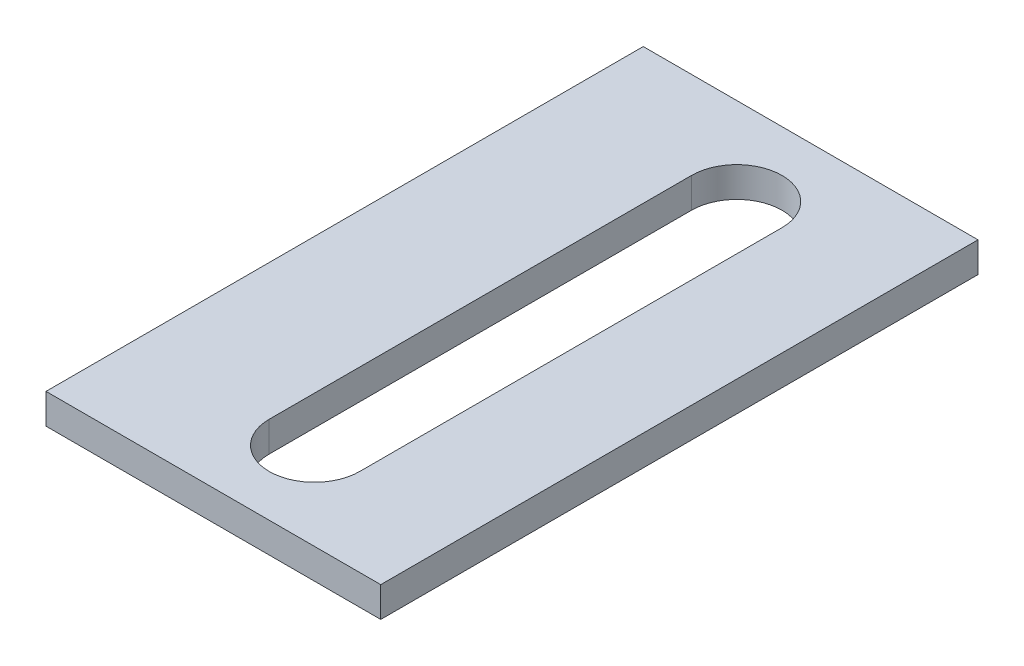
ISO-10303-21;
HEADER;
FILE_DESCRIPTION(('STEP AP214'),'2;1');
FILE_NAME('part.step','',(''),(''),'','','');
FILE_SCHEMA(('AUTOMOTIVE_DESIGN { 1 0 10303 214 1 1 1 1 }'));
ENDSEC;
DATA;
#1=APPLICATION_CONTEXT('core data for automotive mechanical design processes');
#2=APPLICATION_PROTOCOL_DEFINITION('international standard','automotive_design',2000,#1);
#3=PRODUCT_CONTEXT('',#1,'mechanical');
#4=PRODUCT('Part','Part','',(#3));
#5=PRODUCT_RELATED_PRODUCT_CATEGORY('part','',(#4));
#6=PRODUCT_DEFINITION_FORMATION('','',#4);
#7=PRODUCT_DEFINITION_CONTEXT('part definition',#1,'design');
#8=PRODUCT_DEFINITION('design','',#6,#7);
#9=PRODUCT_DEFINITION_SHAPE('','',#8);
#10=(LENGTH_UNIT() NAMED_UNIT(*) SI_UNIT(.MILLI.,.METRE.));
#11=(NAMED_UNIT(*) PLANE_ANGLE_UNIT() SI_UNIT($,.RADIAN.));
#12=(NAMED_UNIT(*) SI_UNIT($,.STERADIAN.) SOLID_ANGLE_UNIT());
#13=UNCERTAINTY_MEASURE_WITH_UNIT(LENGTH_MEASURE(1.E-05),#10,'distance_accuracy_value','');
#14=(GEOMETRIC_REPRESENTATION_CONTEXT(3) GLOBAL_UNCERTAINTY_ASSIGNED_CONTEXT((#13)) GLOBAL_UNIT_ASSIGNED_CONTEXT((#10,
#11,#12)) REPRESENTATION_CONTEXT('',''));
#15=CARTESIAN_POINT('',(0.,0.,0.));
#16=DIRECTION('',(0.,0.,1.));
#17=DIRECTION('',(1.,0.,0.));
#18=AXIS2_PLACEMENT_3D('',#15,#16,#17);
#19=CARTESIAN_POINT('',(-12.,8.4,6.9));
#20=DIRECTION('',(1.,0.,0.));
#21=DIRECTION('',(0.,0.,-1.));
#22=AXIS2_PLACEMENT_3D('',#19,#20,#21);
#23=PLANE('',#22);
#24=DIRECTION('',(0.,1.,0.));
#25=VECTOR('',#24,1.);
#26=CARTESIAN_POINT('',(-12.,8.4,-9.9));
#27=LINE('',#26,#25);
#28=CARTESIAN_POINT('',(-12.,7.4,-9.9));
#29=VERTEX_POINT('',#28);
#30=CARTESIAN_POINT('',(-12.,8.4,-9.9));
#31=VERTEX_POINT('',#30);
#32=EDGE_CURVE('E121',#29,#31,#27,.T.);
#33=ORIENTED_EDGE('',*,*,#32,.F.);
#34=DIRECTION('',(0.,0.,-1.));
#35=VECTOR('',#34,1.);
#36=CARTESIAN_POINT('',(-12.,7.4,-9.9));
#37=LINE('',#36,#35);
#38=CARTESIAN_POINT('',(-12.,7.4,9.9));
#39=VERTEX_POINT('',#38);
#40=EDGE_CURVE('E107',#39,#29,#37,.T.);
#41=ORIENTED_EDGE('',*,*,#40,.F.);
#42=DIRECTION('',(0.,-1.,0.));
#43=VECTOR('',#42,1.);
#44=CARTESIAN_POINT('',(-12.,8.4,9.9));
#45=LINE('',#44,#43);
#46=CARTESIAN_POINT('',(-12.,8.4,9.9));
#47=VERTEX_POINT('',#46);
#48=EDGE_CURVE('E137',#47,#39,#45,.T.);
#49=ORIENTED_EDGE('',*,*,#48,.F.);
#50=DIRECTION('',(0.,0.,1.));
#51=VECTOR('',#50,1.);
#52=CARTESIAN_POINT('',(-12.,8.4,6.9));
#53=LINE('',#52,#51);
#54=EDGE_CURVE('E128',#31,#47,#53,.T.);
#55=ORIENTED_EDGE('',*,*,#54,.F.);
#56=EDGE_LOOP('',(#33,#41,#49,#55));
#57=FACE_BOUND('',#56,.T.);
#58=ADVANCED_FACE('F44',(#57),#23,.F.);
#59=CARTESIAN_POINT('',(0.,8.4,0.));
#60=DIRECTION('',(0.,1.,0.));
#61=DIRECTION('',(0.,0.,1.));
#62=AXIS2_PLACEMENT_3D('',#59,#60,#61);
#63=PLANE('',#62);
#64=DIRECTION('',(0.,0.,1.));
#65=VECTOR('',#64,1.);
#66=CARTESIAN_POINT('',(-0.902865486843041,8.4,-26.1));
#67=LINE('',#66,#65);
#68=CARTESIAN_POINT('',(-0.902865486843041,8.4,-9.9));
#69=VERTEX_POINT('',#68);
#70=CARTESIAN_POINT('',(-0.902865486843041,8.4,9.9));
#71=VERTEX_POINT('',#70);
#72=EDGE_CURVE('E181',#69,#71,#67,.T.);
#73=ORIENTED_EDGE('',*,*,#72,.F.);
#74=DIRECTION('',(1.,0.,0.));
#75=VECTOR('',#74,1.);
#76=CARTESIAN_POINT('',(-12.,8.4,-9.9));
#77=LINE('',#76,#75);
#78=EDGE_CURVE('E131',#31,#69,#77,.T.);
#79=ORIENTED_EDGE('',*,*,#78,.F.);
#80=ORIENTED_EDGE('',*,*,#54,.T.);
#81=DIRECTION('',(-1.,0.,0.));
#82=VECTOR('',#81,1.);
#83=CARTESIAN_POINT('',(-12.,8.4,9.9));
#84=LINE('',#83,#82);
#85=EDGE_CURVE('E132',#71,#47,#84,.T.);
#86=ORIENTED_EDGE('',*,*,#85,.F.);
#87=EDGE_LOOP('',(#73,#79,#80,#86));
#88=FACE_BOUND('',#87,.T.);
#89=CARTESIAN_POINT('',(-6.,8.4,-7.));
#90=DIRECTION('',(0.,1.,0.));
#91=DIRECTION('',(0.,0.,1.));
#92=AXIS2_PLACEMENT_3D('',#89,#90,#91);
#93=CIRCLE('',#92,1.5);
#94=CARTESIAN_POINT('',(-4.5,8.4,-7.));
#95=VERTEX_POINT('',#94);
#96=CARTESIAN_POINT('',(-7.5,8.4,-7.));
#97=VERTEX_POINT('',#96);
#98=EDGE_CURVE('E11',#95,#97,#93,.T.);
#99=ORIENTED_EDGE('',*,*,#98,.F.);
#100=DIRECTION('',(0.,0.,-1.));
#101=VECTOR('',#100,1.);
#102=CARTESIAN_POINT('',(-4.5,8.4,0.));
#103=LINE('',#102,#101);
#104=CARTESIAN_POINT('',(-4.5,8.4,7.));
#105=VERTEX_POINT('',#104);
#106=EDGE_CURVE('E146',#105,#95,#103,.T.);
#107=ORIENTED_EDGE('',*,*,#106,.F.);
#108=CARTESIAN_POINT('',(-6.,8.4,7.));
#109=DIRECTION('',(0.,1.,0.));
#110=DIRECTION('',(0.,0.,1.));
#111=AXIS2_PLACEMENT_3D('',#108,#109,#110);
#112=CIRCLE('',#111,1.5);
#113=CARTESIAN_POINT('',(-7.5,8.4,7.));
#114=VERTEX_POINT('',#113);
#115=EDGE_CURVE('E52',#114,#105,#112,.T.);
#116=ORIENTED_EDGE('',*,*,#115,.F.);
#117=DIRECTION('',(0.,0.,1.));
#118=VECTOR('',#117,1.);
#119=CARTESIAN_POINT('',(-7.5,8.4,0.));
#120=LINE('',#119,#118);
#121=EDGE_CURVE('E143',#97,#114,#120,.T.);
#122=ORIENTED_EDGE('',*,*,#121,.F.);
#123=EDGE_LOOP('',(#99,#107,#116,#122));
#124=FACE_BOUND('',#123,.T.);
#125=ADVANCED_FACE('F163',(#88,#124),#63,.T.);
#126=CARTESIAN_POINT('',(0.,0.,-9.9));
#127=DIRECTION('',(0.,0.,1.));
#128=DIRECTION('',(1.,0.,0.));
#129=AXIS2_PLACEMENT_3D('',#126,#127,#128);
#130=PLANE('',#129);
#131=DIRECTION('',(0.,-1.,0.));
#132=VECTOR('',#131,1.);
#133=CARTESIAN_POINT('',(-0.902865486843041,0.,-9.9));
#134=LINE('',#133,#132);
#135=CARTESIAN_POINT('',(-0.902865486843041,7.4,-9.9));
#136=VERTEX_POINT('',#135);
#137=EDGE_CURVE('E123',#69,#136,#134,.T.);
#138=ORIENTED_EDGE('',*,*,#137,.T.);
#139=DIRECTION('',(1.,0.,0.));
#140=VECTOR('',#139,1.);
#141=CARTESIAN_POINT('',(-12.,7.4,-9.9));
#142=LINE('',#141,#140);
#143=EDGE_CURVE('E67',#29,#136,#142,.T.);
#144=ORIENTED_EDGE('',*,*,#143,.F.);
#145=ORIENTED_EDGE('',*,*,#32,.T.);
#146=ORIENTED_EDGE('',*,*,#78,.T.);
#147=EDGE_LOOP('',(#138,#144,#145,#146));
#148=FACE_BOUND('',#147,.T.);
#149=ADVANCED_FACE('F119',(#148),#130,.F.);
#150=CARTESIAN_POINT('',(0.,0.,9.9));
#151=DIRECTION('',(0.,0.,1.));
#152=DIRECTION('',(1.,0.,0.));
#153=AXIS2_PLACEMENT_3D('',#150,#151,#152);
#154=PLANE('',#153);
#155=DIRECTION('',(-1.,0.,0.));
#156=VECTOR('',#155,1.);
#157=CARTESIAN_POINT('',(0.,7.4,9.9));
#158=LINE('',#157,#156);
#159=CARTESIAN_POINT('',(-0.902865486843041,7.4,9.9));
#160=VERTEX_POINT('',#159);
#161=EDGE_CURVE('E110',#160,#39,#158,.T.);
#162=ORIENTED_EDGE('',*,*,#161,.F.);
#163=DIRECTION('',(0.,-1.,0.));
#164=VECTOR('',#163,1.);
#165=CARTESIAN_POINT('',(-0.902865486843041,8.4,9.9));
#166=LINE('',#165,#164);
#167=EDGE_CURVE('E184',#71,#160,#166,.T.);
#168=ORIENTED_EDGE('',*,*,#167,.F.);
#169=ORIENTED_EDGE('',*,*,#85,.T.);
#170=ORIENTED_EDGE('',*,*,#48,.T.);
#171=EDGE_LOOP('',(#162,#168,#169,#170));
#172=FACE_BOUND('',#171,.T.);
#173=ADVANCED_FACE('F206',(#172),#154,.T.);
#174=CARTESIAN_POINT('',(-6.,-30.6,-7.));
#175=DIRECTION('',(0.,1.,0.));
#176=DIRECTION('',(0.,0.,1.));
#177=AXIS2_PLACEMENT_3D('',#174,#175,#176);
#178=CYLINDRICAL_SURFACE('',#177,1.5);
#179=DIRECTION('',(0.,1.,0.));
#180=VECTOR('',#179,1.);
#181=CARTESIAN_POINT('',(-7.5,-30.6,-7.));
#182=LINE('',#181,#180);
#183=CARTESIAN_POINT('',(-7.5,7.4,-7.));
#184=VERTEX_POINT('',#183);
#185=EDGE_CURVE('E172',#184,#97,#182,.T.);
#186=ORIENTED_EDGE('',*,*,#185,.F.);
#187=CARTESIAN_POINT('',(-6.,7.4,-7.));
#188=DIRECTION('',(0.,1.,0.));
#189=DIRECTION('',(0.,0.,1.));
#190=AXIS2_PLACEMENT_3D('',#187,#188,#189);
#191=CIRCLE('',#190,1.5);
#192=CARTESIAN_POINT('',(-4.5,7.4,-7.));
#193=VERTEX_POINT('',#192);
#194=EDGE_CURVE('E59',#184,#193,#191,.F.);
#195=ORIENTED_EDGE('',*,*,#194,.T.);
#196=DIRECTION('',(0.,1.,0.));
#197=VECTOR('',#196,1.);
#198=CARTESIAN_POINT('',(-4.5,-30.6,-7.));
#199=LINE('',#198,#197);
#200=EDGE_CURVE('E147',#193,#95,#199,.T.);
#201=ORIENTED_EDGE('',*,*,#200,.T.);
#202=ORIENTED_EDGE('',*,*,#98,.T.);
#203=EDGE_LOOP('',(#186,#195,#201,#202));
#204=FACE_BOUND('',#203,.T.);
#205=ADVANCED_FACE('F220',(#204),#178,.F.);
#206=CARTESIAN_POINT('',(-6.,-30.6,7.));
#207=DIRECTION('',(0.,1.,0.));
#208=DIRECTION('',(0.,0.,1.));
#209=AXIS2_PLACEMENT_3D('',#206,#207,#208);
#210=CYLINDRICAL_SURFACE('',#209,1.5);
#211=DIRECTION('',(0.,1.,0.));
#212=VECTOR('',#211,1.);
#213=CARTESIAN_POINT('',(-4.5,-30.6,7.));
#214=LINE('',#213,#212);
#215=CARTESIAN_POINT('',(-4.5,7.4,7.));
#216=VERTEX_POINT('',#215);
#217=EDGE_CURVE('E156',#216,#105,#214,.T.);
#218=ORIENTED_EDGE('',*,*,#217,.F.);
#219=CARTESIAN_POINT('',(-6.,7.4,7.));
#220=DIRECTION('',(0.,1.,0.));
#221=DIRECTION('',(0.,0.,1.));
#222=AXIS2_PLACEMENT_3D('',#219,#220,#221);
#223=CIRCLE('',#222,1.5);
#224=CARTESIAN_POINT('',(-7.5,7.4,7.));
#225=VERTEX_POINT('',#224);
#226=EDGE_CURVE('E196',#216,#225,#223,.F.);
#227=ORIENTED_EDGE('',*,*,#226,.T.);
#228=DIRECTION('',(0.,1.,0.));
#229=VECTOR('',#228,1.);
#230=CARTESIAN_POINT('',(-7.5,-30.6,7.));
#231=LINE('',#230,#229);
#232=EDGE_CURVE('E158',#225,#114,#231,.T.);
#233=ORIENTED_EDGE('',*,*,#232,.T.);
#234=ORIENTED_EDGE('',*,*,#115,.T.);
#235=EDGE_LOOP('',(#218,#227,#233,#234));
#236=FACE_BOUND('',#235,.T.);
#237=ADVANCED_FACE('F154',(#236),#210,.F.);
#238=CARTESIAN_POINT('',(-4.5,-30.6,-7.));
#239=DIRECTION('',(1.,0.,0.));
#240=DIRECTION('',(0.,0.,-1.));
#241=AXIS2_PLACEMENT_3D('',#238,#239,#240);
#242=PLANE('',#241);
#243=ORIENTED_EDGE('',*,*,#200,.F.);
#244=DIRECTION('',(0.,0.,1.));
#245=VECTOR('',#244,1.);
#246=CARTESIAN_POINT('',(-4.5,7.4,-7.));
#247=LINE('',#246,#245);
#248=EDGE_CURVE('E190',#193,#216,#247,.T.);
#249=ORIENTED_EDGE('',*,*,#248,.T.);
#250=ORIENTED_EDGE('',*,*,#217,.T.);
#251=ORIENTED_EDGE('',*,*,#106,.T.);
#252=EDGE_LOOP('',(#243,#249,#250,#251));
#253=FACE_BOUND('',#252,.T.);
#254=ADVANCED_FACE('F227',(#253),#242,.F.);
#255=CARTESIAN_POINT('',(-7.5,-30.6,-7.));
#256=DIRECTION('',(-1.,0.,0.));
#257=DIRECTION('',(0.,0.,1.));
#258=AXIS2_PLACEMENT_3D('',#255,#256,#257);
#259=PLANE('',#258);
#260=ORIENTED_EDGE('',*,*,#232,.F.);
#261=DIRECTION('',(0.,0.,-1.));
#262=VECTOR('',#261,1.);
#263=CARTESIAN_POINT('',(-7.5,7.4,-7.));
#264=LINE('',#263,#262);
#265=EDGE_CURVE('E199',#225,#184,#264,.T.);
#266=ORIENTED_EDGE('',*,*,#265,.T.);
#267=ORIENTED_EDGE('',*,*,#185,.T.);
#268=ORIENTED_EDGE('',*,*,#121,.T.);
#269=EDGE_LOOP('',(#260,#266,#267,#268));
#270=FACE_BOUND('',#269,.T.);
#271=ADVANCED_FACE('F224',(#270),#259,.F.);
#272=CARTESIAN_POINT('',(-0.902865486843041,8.4,-26.1));
#273=DIRECTION('',(-1.,0.,0.));
#274=DIRECTION('',(0.,0.,1.));
#275=AXIS2_PLACEMENT_3D('',#272,#273,#274);
#276=PLANE('',#275);
#277=ORIENTED_EDGE('',*,*,#167,.T.);
#278=DIRECTION('',(0.,0.,1.));
#279=VECTOR('',#278,1.);
#280=CARTESIAN_POINT('',(-0.902865486843041,7.4,-9.9));
#281=LINE('',#280,#279);
#282=EDGE_CURVE('E125',#136,#160,#281,.T.);
#283=ORIENTED_EDGE('',*,*,#282,.F.);
#284=ORIENTED_EDGE('',*,*,#137,.F.);
#285=ORIENTED_EDGE('',*,*,#72,.T.);
#286=EDGE_LOOP('',(#277,#283,#284,#285));
#287=FACE_BOUND('',#286,.T.);
#288=ADVANCED_FACE('F208',(#287),#276,.F.);
#289=CARTESIAN_POINT('',(0.,7.4,0.));
#290=DIRECTION('',(0.,1.,0.));
#291=DIRECTION('',(0.,0.,1.));
#292=AXIS2_PLACEMENT_3D('',#289,#290,#291);
#293=PLANE('',#292);
#294=ORIENTED_EDGE('',*,*,#161,.T.);
#295=ORIENTED_EDGE('',*,*,#40,.T.);
#296=ORIENTED_EDGE('',*,*,#143,.T.);
#297=ORIENTED_EDGE('',*,*,#282,.T.);
#298=EDGE_LOOP('',(#294,#295,#296,#297));
#299=FACE_BOUND('',#298,.T.);
#300=ORIENTED_EDGE('',*,*,#194,.F.);
#301=ORIENTED_EDGE('',*,*,#265,.F.);
#302=ORIENTED_EDGE('',*,*,#226,.F.);
#303=ORIENTED_EDGE('',*,*,#248,.F.);
#304=EDGE_LOOP('',(#300,#301,#302,#303));
#305=FACE_BOUND('',#304,.T.);
#306=ADVANCED_FACE('F108',(#299,#305),#293,.F.);
#307=CLOSED_SHELL('',(#58,#125,#149,#173,#205,#237,#254,#271,#288,#306));
#308=MANIFOLD_SOLID_BREP('B2',#307);
#309=ADVANCED_BREP_SHAPE_REPRESENTATION('',(#18,#308),#14);
#310=SHAPE_DEFINITION_REPRESENTATION(#9,#309);
ENDSEC;
END-ISO-10303-21;
